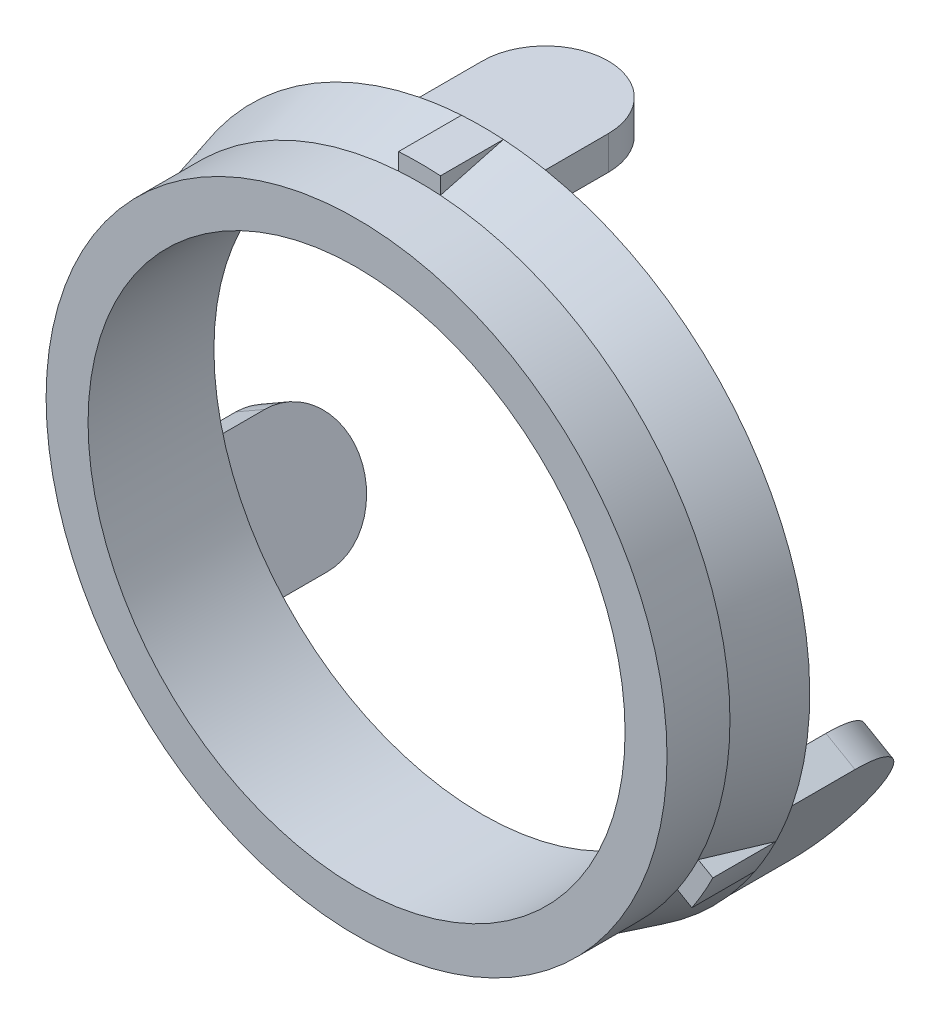
ISO-10303-21;
HEADER;
FILE_DESCRIPTION(('STEP AP214'),'2;1');
FILE_NAME('part.step','',(''),(''),'','','');
FILE_SCHEMA(('AUTOMOTIVE_DESIGN { 1 0 10303 214 1 1 1 1 }'));
ENDSEC;
DATA;
#1=APPLICATION_CONTEXT('core data for automotive mechanical design processes');
#2=APPLICATION_PROTOCOL_DEFINITION('international standard','automotive_design',2000,#1);
#3=PRODUCT_CONTEXT('',#1,'mechanical');
#4=PRODUCT('Part','Part','',(#3));
#5=PRODUCT_RELATED_PRODUCT_CATEGORY('part','',(#4));
#6=PRODUCT_DEFINITION_FORMATION('','',#4);
#7=PRODUCT_DEFINITION_CONTEXT('part definition',#1,'design');
#8=PRODUCT_DEFINITION('design','',#6,#7);
#9=PRODUCT_DEFINITION_SHAPE('','',#8);
#10=(LENGTH_UNIT() NAMED_UNIT(*) SI_UNIT(.MILLI.,.METRE.));
#11=(NAMED_UNIT(*) PLANE_ANGLE_UNIT() SI_UNIT($,.RADIAN.));
#12=(NAMED_UNIT(*) SI_UNIT($,.STERADIAN.) SOLID_ANGLE_UNIT());
#13=UNCERTAINTY_MEASURE_WITH_UNIT(LENGTH_MEASURE(1.E-05),#10,'distance_accuracy_value','');
#14=(GEOMETRIC_REPRESENTATION_CONTEXT(3) GLOBAL_UNCERTAINTY_ASSIGNED_CONTEXT((#13)) GLOBAL_UNIT_ASSIGNED_CONTEXT((#10,
#11,#12)) REPRESENTATION_CONTEXT('',''));
#15=CARTESIAN_POINT('',(0.,0.,0.));
#16=DIRECTION('',(0.,0.,1.));
#17=DIRECTION('',(1.,0.,0.));
#18=AXIS2_PLACEMENT_3D('',#15,#16,#17);
#19=CARTESIAN_POINT('',(39.0096189432334,0.,-7.50000000000003));
#20=DIRECTION('',(0.,0.,-1.));
#21=DIRECTION('',(-1.,0.,0.));
#22=AXIS2_PLACEMENT_3D('',#19,#20,#21);
#23=PLANE('',#22);
#24=CARTESIAN_POINT('',(0.,0.,-7.50000000000001));
#25=DIRECTION('',(0.,0.,1.));
#26=DIRECTION('',(1.,0.,0.));
#27=AXIS2_PLACEMENT_3D('',#24,#25,#26);
#28=CIRCLE('',#27,32.);
#29=CARTESIAN_POINT('',(32.,0.,-7.50000000000003));
#30=VERTEX_POINT('',#29);
#31=EDGE_CURVE('E452',#30,#30,#28,.T.);
#32=ORIENTED_EDGE('',*,*,#31,.T.);
#33=EDGE_LOOP('',(#32));
#34=FACE_BOUND('',#33,.T.);
#35=DIRECTION('',(0.499999999999992,-0.866025403784443,0.));
#36=VECTOR('',#35,1.);
#37=CARTESIAN_POINT('',(-33.4389567290363,-10.6457366310846,-7.5));
#38=LINE('',#37,#36);
#39=CARTESIAN_POINT('',(-33.4389567290363,-10.6457366310846,-7.5));
#40=VERTEX_POINT('',#39);
#41=CARTESIAN_POINT('',(-25.9389567290364,-23.6361176878513,-7.5));
#42=VERTEX_POINT('',#41);
#43=EDGE_CURVE('E200',#40,#42,#38,.T.);
#44=ORIENTED_EDGE('',*,*,#43,.F.);
#45=DIRECTION('',(0.866025403784443,0.499999999999992,0.));
#46=VECTOR('',#45,1.);
#47=CARTESIAN_POINT('',(-33.4389567290363,-10.6457366310846,-7.5));
#48=LINE('',#47,#46);
#49=CARTESIAN_POINT('',(-36.9030583441741,-12.6457366310846,-7.5));
#50=VERTEX_POINT('',#49);
#51=EDGE_CURVE('E209',#50,#40,#48,.T.);
#52=ORIENTED_EDGE('',*,*,#51,.F.);
#53=CARTESIAN_POINT('',(0.,0.,-7.50000000000001));
#54=DIRECTION('',(0.,0.,1.));
#55=DIRECTION('',(1.,0.,0.));
#56=AXIS2_PLACEMENT_3D('',#53,#54,#55);
#57=CIRCLE('',#56,39.0096189432334);
#58=CARTESIAN_POINT('',(-7.5,38.2818543189364,-7.50000000000001));
#59=VERTEX_POINT('',#58);
#60=EDGE_CURVE('E453',#59,#50,#57,.T.);
#61=ORIENTED_EDGE('',*,*,#60,.F.);
#62=DIRECTION('',(0.,1.,0.));
#63=VECTOR('',#62,1.);
#64=CARTESIAN_POINT('',(-7.5,34.2818543189364,-7.50000000000001));
#65=LINE('',#64,#63);
#66=CARTESIAN_POINT('',(-7.5,34.2818543189364,-7.50000000000001));
#67=VERTEX_POINT('',#66);
#68=EDGE_CURVE('E318',#67,#59,#65,.T.);
#69=ORIENTED_EDGE('',*,*,#68,.F.);
#70=DIRECTION('',(-1.,0.,0.));
#71=VECTOR('',#70,1.);
#72=CARTESIAN_POINT('',(7.5,34.2818543189364,-7.50000000000002));
#73=LINE('',#72,#71);
#74=CARTESIAN_POINT('',(7.5,34.2818543189364,-7.50000000000002));
#75=VERTEX_POINT('',#74);
#76=EDGE_CURVE('E314',#75,#67,#73,.T.);
#77=ORIENTED_EDGE('',*,*,#76,.F.);
#78=DIRECTION('',(0.,-1.,0.));
#79=VECTOR('',#78,1.);
#80=CARTESIAN_POINT('',(7.5,34.2818543189364,-7.50000000000002));
#81=LINE('',#80,#79);
#82=CARTESIAN_POINT('',(7.50000000000001,38.2818543189364,-7.50000000000002));
#83=VERTEX_POINT('',#82);
#84=EDGE_CURVE('E310',#83,#75,#81,.T.);
#85=ORIENTED_EDGE('',*,*,#84,.F.);
#86=CARTESIAN_POINT('',(36.9030583441739,-12.6457366310851,-7.50000000000003));
#87=VERTEX_POINT('',#86);
#88=EDGE_CURVE('E438',#87,#83,#57,.T.);
#89=ORIENTED_EDGE('',*,*,#88,.F.);
#90=DIRECTION('',(0.866025403784436,-0.500000000000004,0.));
#91=VECTOR('',#90,1.);
#92=CARTESIAN_POINT('',(33.4389567290362,-10.6457366310851,-7.50000000000003));
#93=LINE('',#92,#91);
#94=CARTESIAN_POINT('',(33.4389567290362,-10.6457366310851,-7.50000000000003));
#95=VERTEX_POINT('',#94);
#96=EDGE_CURVE('E245',#95,#87,#93,.T.);
#97=ORIENTED_EDGE('',*,*,#96,.F.);
#98=DIRECTION('',(0.500000000000004,0.866025403784436,0.));
#99=VECTOR('',#98,1.);
#100=CARTESIAN_POINT('',(25.9389567290361,-23.6361176878516,-7.50000000000002));
#101=LINE('',#100,#99);
#102=CARTESIAN_POINT('',(25.9389567290361,-23.6361176878516,-7.50000000000002));
#103=VERTEX_POINT('',#102);
#104=EDGE_CURVE('E241',#103,#95,#101,.T.);
#105=ORIENTED_EDGE('',*,*,#104,.F.);
#106=DIRECTION('',(-0.866025403784436,0.500000000000004,0.));
#107=VECTOR('',#106,1.);
#108=CARTESIAN_POINT('',(25.9389567290361,-23.6361176878516,-7.50000000000002));
#109=LINE('',#108,#107);
#110=CARTESIAN_POINT('',(29.4030583441739,-25.6361176878516,-7.50000000000003));
#111=VERTEX_POINT('',#110);
#112=EDGE_CURVE('E205',#111,#103,#109,.T.);
#113=ORIENTED_EDGE('',*,*,#112,.F.);
#114=CARTESIAN_POINT('',(-29.4030583441742,-25.6361176878512,-7.5));
#115=VERTEX_POINT('',#114);
#116=EDGE_CURVE('E434',#115,#111,#57,.T.);
#117=ORIENTED_EDGE('',*,*,#116,.F.);
#118=DIRECTION('',(-0.866025403784443,-0.499999999999992,0.));
#119=VECTOR('',#118,1.);
#120=CARTESIAN_POINT('',(-25.9389567290364,-23.6361176878513,-7.5));
#121=LINE('',#120,#119);
#122=EDGE_CURVE('E222',#42,#115,#121,.T.);
#123=ORIENTED_EDGE('',*,*,#122,.F.);
#124=EDGE_LOOP('',(#44,#52,#61,#69,#77,#85,#89,#97,#105,#113,#117,#123));
#125=FACE_BOUND('',#124,.T.);
#126=ADVANCED_FACE('F39',(#34,#125),#23,.T.);
#127=CARTESIAN_POINT('',(-34.9638736660772,-17.2996505270732,-7.5));
#128=VERTEX_POINT('',#127);
#129=EDGE_CURVE('E441',#50,#128,#57,.T.);
#130=ORIENTED_EDGE('',*,*,#129,.F.);
#131=DIRECTION('',(-0.499999999999992,0.866025403784443,0.));
#132=VECTOR('',#131,1.);
#133=CARTESIAN_POINT('',(-36.9030583441741,-12.6457366310846,-7.5));
#134=LINE('',#133,#132);
#135=EDGE_CURVE('E226',#115,#50,#134,.T.);
#136=ORIENTED_EDGE('',*,*,#135,.F.);
#137=CARTESIAN_POINT('',(-32.4638736660773,-21.6297775459954,-7.5));
#138=VERTEX_POINT('',#137);
#139=EDGE_CURVE('E437',#138,#115,#57,.T.);
#140=ORIENTED_EDGE('',*,*,#139,.F.);
#141=CARTESIAN_POINT('',(0.,0.,-7.50000000000001));
#142=DIRECTION('',(0.,0.,-1.));
#143=DIRECTION('',(-0.499999999999992,0.866025403784443,0.));
#144=AXIS2_PLACEMENT_3D('',#141,#142,#143);
#145=CIRCLE('',#144,39.0096189432334);
#146=EDGE_CURVE('E265',#138,#128,#145,.T.);
#147=ORIENTED_EDGE('',*,*,#146,.T.);
#148=EDGE_LOOP('',(#130,#136,#140,#147));
#149=FACE_BOUND('',#148,.T.);
#150=ADVANCED_FACE('F414',(#149),#23,.T.);
#151=CARTESIAN_POINT('',(32.463873666077,-21.6297775459959,-7.50000000000003));
#152=VERTEX_POINT('',#151);
#153=EDGE_CURVE('E426',#111,#152,#57,.T.);
#154=ORIENTED_EDGE('',*,*,#153,.F.);
#155=DIRECTION('',(-0.500000000000004,-0.866025403784436,0.));
#156=VECTOR('',#155,1.);
#157=CARTESIAN_POINT('',(29.4030583441739,-25.6361176878516,-7.50000000000003));
#158=LINE('',#157,#156);
#159=EDGE_CURVE('E249',#87,#111,#158,.T.);
#160=ORIENTED_EDGE('',*,*,#159,.F.);
#161=CARTESIAN_POINT('',(34.963873666077,-17.2996505270737,-7.50000000000003));
#162=VERTEX_POINT('',#161);
#163=EDGE_CURVE('E435',#162,#87,#57,.T.);
#164=ORIENTED_EDGE('',*,*,#163,.F.);
#165=CARTESIAN_POINT('',(0.,0.,-7.50000000000001));
#166=DIRECTION('',(0.,0.,-1.));
#167=DIRECTION('',(-0.500000000000004,-0.866025403784436,0.));
#168=AXIS2_PLACEMENT_3D('',#165,#166,#167);
#169=CIRCLE('',#168,39.0096189432334);
#170=EDGE_CURVE('E284',#162,#152,#169,.T.);
#171=ORIENTED_EDGE('',*,*,#170,.T.);
#172=EDGE_LOOP('',(#154,#160,#164,#171));
#173=FACE_BOUND('',#172,.T.);
#174=ADVANCED_FACE('F405',(#173),#23,.T.);
#175=CARTESIAN_POINT('',(0.,0.,0.));
#176=DIRECTION('',(0.,0.,-1.));
#177=DIRECTION('',(-1.,0.,0.));
#178=AXIS2_PLACEMENT_3D('',#175,#176,#177);
#179=CONICAL_SURFACE('',#178,37.,0.261799387799142);
#180=CARTESIAN_POINT('',(-32.4639201718391,-21.6298043961095,-7.5002));
#181=CARTESIAN_POINT('',(-32.1732422755763,-21.4619814344548,-6.25012366516664));
#182=CARTESIAN_POINT('',(-31.8825487891638,-21.2941494718228,-5.00005216442005));
#183=CARTESIAN_POINT('',(-31.3011306360358,-20.9584675446026,-2.49991883108672));
#184=CARTESIAN_POINT('',(-31.0104059693204,-20.7906175800144,-1.24985699849997));
#185=CARTESIAN_POINT('',(-30.7196657124552,-20.622758614449,0.000199999999999813));
#186=B_SPLINE_CURVE_WITH_KNOTS('',3,(#180,#181,#182,#183,#184,#185),.UNSPECIFIED.,.F.,.F.,(4,2,
4),(0.,3.88305823408842,7.76611646821942),.UNSPECIFIED.);
#187=CARTESIAN_POINT('',(-30.7197122289209,-20.622785470743,0.));
#188=VERTEX_POINT('',#187);
#189=EDGE_CURVE('E581',#138,#188,#186,.T.);
#190=ORIENTED_EDGE('',*,*,#189,.F.);
#191=ORIENTED_EDGE('',*,*,#139,.T.);
#192=ORIENTED_EDGE('',*,*,#116,.T.);
#193=ORIENTED_EDGE('',*,*,#153,.T.);
#194=CARTESIAN_POINT('',(30.7196657124549,-20.6227586144495,0.000199999999973979));
#195=CARTESIAN_POINT('',(31.0104059693201,-20.7906175800149,-1.2498569985));
#196=CARTESIAN_POINT('',(31.3011306360355,-20.9584675446031,-2.49991883108674));
#197=CARTESIAN_POINT('',(31.8825487891635,-21.2941494718232,-5.00005216442007));
#198=CARTESIAN_POINT('',(32.173242275576,-21.4619814344552,-6.25012366516666));
#199=CARTESIAN_POINT('',(32.4639201718388,-21.62980439611,-7.50020000000002));
#200=B_SPLINE_CURVE_WITH_KNOTS('',3,(#194,#195,#196,#197,#198,#199),.UNSPECIFIED.,.F.,.F.,(4,2,
4),(0.,3.88305823413099,7.7661164682194),.UNSPECIFIED.);
#201=CARTESIAN_POINT('',(30.7197122289206,-20.6227854707435,0.));
#202=VERTEX_POINT('',#201);
#203=EDGE_CURVE('E491',#202,#152,#200,.T.);
#204=ORIENTED_EDGE('',*,*,#203,.F.);
#205=CARTESIAN_POINT('',(0.,0.,0.));
#206=DIRECTION('',(0.,0.,1.));
#207=DIRECTION('',(1.,0.,0.));
#208=AXIS2_PLACEMENT_3D('',#205,#206,#207);
#209=CIRCLE('',#208,37.);
#210=EDGE_CURVE('E564',#188,#202,#209,.T.);
#211=ORIENTED_EDGE('',*,*,#210,.F.);
#212=EDGE_LOOP('',(#190,#191,#192,#193,#204,#211));
#213=FACE_BOUND('',#212,.T.);
#214=ADVANCED_FACE('F411',(#213),#179,.T.);
#215=CARTESIAN_POINT('',(34.9639201718388,-17.2996773771878,-7.50020000000001));
#216=CARTESIAN_POINT('',(34.6732422755761,-17.131854415533,-6.25012366516666));
#217=CARTESIAN_POINT('',(34.3825487891635,-16.964022452901,-5.00005216442007));
#218=CARTESIAN_POINT('',(33.8011306360355,-16.6283405256809,-2.49991883108674));
#219=CARTESIAN_POINT('',(33.5104059693201,-16.4604905610927,-1.2498569985));
#220=CARTESIAN_POINT('',(33.2196657124549,-16.2926315955273,0.000199999999971305));
#221=B_SPLINE_CURVE_WITH_KNOTS('',3,(#215,#216,#217,#218,#219,#220),.UNSPECIFIED.,.F.,.F.,(4,2,
4),(0.,3.88305823408841,7.7661164682194),.UNSPECIFIED.);
#222=CARTESIAN_POINT('',(33.2197122289206,-16.2926584518213,0.));
#223=VERTEX_POINT('',#222);
#224=EDGE_CURVE('E502',#162,#223,#221,.T.);
#225=ORIENTED_EDGE('',*,*,#224,.F.);
#226=ORIENTED_EDGE('',*,*,#163,.T.);
#227=ORIENTED_EDGE('',*,*,#88,.T.);
#228=CARTESIAN_POINT('',(2.5,38.9294280730693,-7.50000000000001));
#229=VERTEX_POINT('',#228);
#230=EDGE_CURVE('E444',#83,#229,#57,.T.);
#231=ORIENTED_EDGE('',*,*,#230,.T.);
#232=CARTESIAN_POINT('',(2.5,34.4942087681963,9.01407818865996));
#233=CARTESIAN_POINT('',(2.5,35.0657074153788,6.88679370650943));
#234=CARTESIAN_POINT('',(2.5,35.6371379779062,4.75949093438337));
#235=CARTESIAN_POINT('',(2.5,36.7798791342439,0.504853173492177));
#236=CARTESIAN_POINT('',(2.5,37.3511897280547,-1.62248181527288));
#237=CARTESIAN_POINT('',(2.5,38.493707150006,-5.87717965526099));
#238=CARTESIAN_POINT('',(2.5,39.0649139781465,-8.00454250648401));
#239=CARTESIAN_POINT('',(2.49999999999999,40.2072362020273,-12.259292762519));
#240=CARTESIAN_POINT('',(2.49999999999999,40.7783515977672,-14.386680167331));
#241=CARTESIAN_POINT('',(2.49999999999999,41.3494274423728,-16.51407818866));
#242=B_SPLINE_CURVE_WITH_KNOTS('',3,(#232,#233,#234,#235,#236,#237,#238,#239,#240,#241),
.UNSPECIFIED.,.F.,.F.,(4,2,2,2,4),(0.,6.60814268238509,13.216285348593,19.8244280108105,
26.4325706891827),.UNSPECIFIED.);
#243=CARTESIAN_POINT('',(2.5,36.9154439225644,0.));
#244=VERTEX_POINT('',#243);
#245=EDGE_CURVE('E354',#244,#229,#242,.T.);
#246=ORIENTED_EDGE('',*,*,#245,.F.);
#247=EDGE_CURVE('E551',#223,#244,#209,.T.);
#248=ORIENTED_EDGE('',*,*,#247,.F.);
#249=EDGE_LOOP('',(#225,#226,#227,#231,#246,#248));
#250=FACE_BOUND('',#249,.T.);
#251=ADVANCED_FACE('F409',(#250),#179,.T.);
#252=CARTESIAN_POINT('',(-33.2196657124551,-16.2926315955268,0.000199999999999204));
#253=CARTESIAN_POINT('',(-33.5104059693203,-16.4604905610922,-1.24985699849997));
#254=CARTESIAN_POINT('',(-33.8011306360357,-16.6283405256804,-2.49991883108672));
#255=CARTESIAN_POINT('',(-34.3825487891637,-16.9640224529006,-5.00005216442005));
#256=CARTESIAN_POINT('',(-34.6732422755763,-17.1318544155325,-6.25012366516664));
#257=CARTESIAN_POINT('',(-34.9639201718391,-17.2996773771873,-7.5002));
#258=B_SPLINE_CURVE_WITH_KNOTS('',3,(#252,#253,#254,#255,#256,#257),.UNSPECIFIED.,.F.,.F.,(4,2,
4),(0.,3.883058234131,7.76611646821941),.UNSPECIFIED.);
#259=CARTESIAN_POINT('',(-33.2197122289208,-16.2926584518208,0.));
#260=VERTEX_POINT('',#259);
#261=EDGE_CURVE('E554',#260,#128,#258,.T.);
#262=ORIENTED_EDGE('',*,*,#261,.F.);
#263=CARTESIAN_POINT('',(-2.5,36.9154439225644,0.));
#264=VERTEX_POINT('',#263);
#265=EDGE_CURVE('E553',#264,#260,#209,.T.);
#266=ORIENTED_EDGE('',*,*,#265,.F.);
#267=CARTESIAN_POINT('',(-2.5,41.3494274423728,-16.51407818866));
#268=CARTESIAN_POINT('',(-2.5,40.7783515977672,-14.386680167331));
#269=CARTESIAN_POINT('',(-2.5,40.2072362020273,-12.259292762519));
#270=CARTESIAN_POINT('',(-2.5,39.0649139781465,-8.00454250648401));
#271=CARTESIAN_POINT('',(-2.5,38.493707150006,-5.87717965526098));
#272=CARTESIAN_POINT('',(-2.5,37.3511897280547,-1.62248181527288));
#273=CARTESIAN_POINT('',(-2.5,36.7798791342439,0.504853173492177));
#274=CARTESIAN_POINT('',(-2.5,35.6371379779062,4.75949093438337));
#275=CARTESIAN_POINT('',(-2.5,35.0657074153788,6.88679370650943));
#276=CARTESIAN_POINT('',(-2.5,34.4942087681963,9.01407818865996));
#277=B_SPLINE_CURVE_WITH_KNOTS('',3,(#267,#268,#269,#270,#271,#272,#273,#274,#275,#276),
.UNSPECIFIED.,.F.,.F.,(4,2,2,2,4),(0.,6.60814267837222,13.2162853405897,19.8244280067976,
26.4325706891827),.UNSPECIFIED.);
#278=CARTESIAN_POINT('',(-2.5,38.9294280730693,-7.50000000000001));
#279=VERTEX_POINT('',#278);
#280=EDGE_CURVE('E367',#279,#264,#277,.T.);
#281=ORIENTED_EDGE('',*,*,#280,.F.);
#282=EDGE_CURVE('E459',#279,#59,#57,.T.);
#283=ORIENTED_EDGE('',*,*,#282,.T.);
#284=ORIENTED_EDGE('',*,*,#60,.T.);
#285=ORIENTED_EDGE('',*,*,#129,.T.);
#286=EDGE_LOOP('',(#262,#266,#281,#283,#284,#285));
#287=FACE_BOUND('',#286,.T.);
#288=ADVANCED_FACE('F374',(#287),#179,.T.);
#289=DIRECTION('',(1.,0.,0.));
#290=VECTOR('',#289,1.);
#291=CARTESIAN_POINT('',(7.5,38.2818543189364,-7.50000000000002));
#292=LINE('',#291,#290);
#293=EDGE_CURVE('E322',#59,#83,#292,.T.);
#294=ORIENTED_EDGE('',*,*,#293,.F.);
#295=ORIENTED_EDGE('',*,*,#282,.F.);
#296=EDGE_CURVE('E442',#229,#279,#57,.T.);
#297=ORIENTED_EDGE('',*,*,#296,.F.);
#298=ORIENTED_EDGE('',*,*,#230,.F.);
#299=EDGE_LOOP('',(#294,#295,#297,#298));
#300=FACE_BOUND('',#299,.T.);
#301=ADVANCED_FACE('F401',(#300),#23,.T.);
#302=CARTESIAN_POINT('',(0.,0.,7.5));
#303=DIRECTION('',(0.,0.,1.));
#304=DIRECTION('',(1.,0.,0.));
#305=AXIS2_PLACEMENT_3D('',#302,#303,#304);
#306=CYLINDRICAL_SURFACE('',#305,32.);
#307=CARTESIAN_POINT('',(0.,0.,7.50000000000001));
#308=DIRECTION('',(0.,0.,1.));
#309=DIRECTION('',(1.,0.,0.));
#310=AXIS2_PLACEMENT_3D('',#307,#308,#309);
#311=CIRCLE('',#310,32.);
#312=CARTESIAN_POINT('',(32.,0.,7.5));
#313=VERTEX_POINT('',#312);
#314=EDGE_CURVE('E567',#313,#313,#311,.T.);
#315=ORIENTED_EDGE('',*,*,#314,.T.);
#316=EDGE_LOOP('',(#315));
#317=FACE_BOUND('',#316,.T.);
#318=ORIENTED_EDGE('',*,*,#31,.F.);
#319=EDGE_LOOP('',(#318));
#320=FACE_BOUND('',#319,.T.);
#321=ADVANCED_FACE('F398',(#317,#320),#306,.F.);
#322=CARTESIAN_POINT('',(32.,0.,7.5));
#323=DIRECTION('',(0.,0.,1.));
#324=DIRECTION('',(1.,0.,0.));
#325=AXIS2_PLACEMENT_3D('',#322,#323,#324);
#326=PLANE('',#325);
#327=CARTESIAN_POINT('',(0.,0.,7.50000000000002));
#328=DIRECTION('',(0.,0.,1.));
#329=DIRECTION('',(1.,0.,0.));
#330=AXIS2_PLACEMENT_3D('',#327,#328,#329);
#331=CIRCLE('',#330,37.);
#332=CARTESIAN_POINT('',(37.,0.,7.5));
#333=VERTEX_POINT('',#332);
#334=EDGE_CURVE('E563',#333,#333,#331,.T.);
#335=ORIENTED_EDGE('',*,*,#334,.T.);
#336=EDGE_LOOP('',(#335));
#337=FACE_BOUND('',#336,.T.);
#338=ORIENTED_EDGE('',*,*,#314,.F.);
#339=EDGE_LOOP('',(#338));
#340=FACE_BOUND('',#339,.T.);
#341=ADVANCED_FACE('F394',(#337,#340),#326,.T.);
#342=CARTESIAN_POINT('',(0.,0.,7.5));
#343=DIRECTION('',(0.,0.,1.));
#344=DIRECTION('',(1.,0.,0.));
#345=AXIS2_PLACEMENT_3D('',#342,#343,#344);
#346=CYLINDRICAL_SURFACE('',#345,37.);
#347=EDGE_CURVE('E547',#244,#264,#209,.T.);
#348=ORIENTED_EDGE('',*,*,#347,.T.);
#349=ORIENTED_EDGE('',*,*,#265,.T.);
#350=EDGE_CURVE('E557',#260,#188,#209,.T.);
#351=ORIENTED_EDGE('',*,*,#350,.T.);
#352=ORIENTED_EDGE('',*,*,#210,.T.);
#353=EDGE_CURVE('E558',#202,#223,#209,.T.);
#354=ORIENTED_EDGE('',*,*,#353,.T.);
#355=ORIENTED_EDGE('',*,*,#247,.T.);
#356=EDGE_LOOP('',(#348,#349,#351,#352,#354,#355));
#357=FACE_BOUND('',#356,.T.);
#358=ORIENTED_EDGE('',*,*,#334,.F.);
#359=EDGE_LOOP('',(#358));
#360=FACE_BOUND('',#359,.T.);
#361=ADVANCED_FACE('F390',(#357,#360),#346,.T.);
#362=CARTESIAN_POINT('',(0.,0.,0.));
#363=DIRECTION('',(0.,0.,-1.));
#364=DIRECTION('',(-1.,0.,0.));
#365=AXIS2_PLACEMENT_3D('',#362,#363,#364);
#366=CYLINDRICAL_SURFACE('',#365,39.0096189432334);
#367=ORIENTED_EDGE('',*,*,#296,.T.);
#368=DIRECTION('',(0.,0.,-1.));
#369=VECTOR('',#368,1.);
#370=CARTESIAN_POINT('',(-2.5,38.9294280730693,0.));
#371=LINE('',#370,#369);
#372=CARTESIAN_POINT('',(-2.5,38.9294280730693,0.));
#373=VERTEX_POINT('',#372);
#374=EDGE_CURVE('E351',#373,#279,#371,.T.);
#375=ORIENTED_EDGE('',*,*,#374,.F.);
#376=CARTESIAN_POINT('',(0.,0.,0.));
#377=DIRECTION('',(0.,0.,-1.));
#378=DIRECTION('',(1.,0.,0.));
#379=AXIS2_PLACEMENT_3D('',#376,#377,#378);
#380=CIRCLE('',#379,39.0096189432334);
#381=CARTESIAN_POINT('',(2.5,38.9294280730693,0.));
#382=VERTEX_POINT('',#381);
#383=EDGE_CURVE('E339',#373,#382,#380,.T.);
#384=ORIENTED_EDGE('',*,*,#383,.T.);
#385=DIRECTION('',(0.,0.,-1.));
#386=VECTOR('',#385,1.);
#387=CARTESIAN_POINT('',(2.5,38.9294280730693,0.));
#388=LINE('',#387,#386);
#389=EDGE_CURVE('E350',#382,#229,#388,.T.);
#390=ORIENTED_EDGE('',*,*,#389,.T.);
#391=EDGE_LOOP('',(#367,#375,#384,#390));
#392=FACE_BOUND('',#391,.T.);
#393=ADVANCED_FACE('F387',(#392),#366,.T.);
#394=CARTESIAN_POINT('',(-2.5,33.9294280730693,0.));
#395=DIRECTION('',(-1.,0.,0.));
#396=DIRECTION('',(0.,-1.,0.));
#397=AXIS2_PLACEMENT_3D('',#394,#395,#396);
#398=PLANE('',#397);
#399=ORIENTED_EDGE('',*,*,#374,.T.);
#400=ORIENTED_EDGE('',*,*,#280,.T.);
#401=DIRECTION('',(0.,1.,0.));
#402=VECTOR('',#401,1.);
#403=CARTESIAN_POINT('',(-2.5,33.9294280730693,0.));
#404=LINE('',#403,#402);
#405=EDGE_CURVE('E347',#264,#373,#404,.T.);
#406=ORIENTED_EDGE('',*,*,#405,.T.);
#407=EDGE_LOOP('',(#399,#400,#406));
#408=FACE_BOUND('',#407,.T.);
#409=ADVANCED_FACE('F383',(#408),#398,.T.);
#410=CARTESIAN_POINT('',(2.5,38.9294280730693,0.));
#411=DIRECTION('',(1.,0.,0.));
#412=DIRECTION('',(0.,0.,-1.));
#413=AXIS2_PLACEMENT_3D('',#410,#411,#412);
#414=PLANE('',#413);
#415=DIRECTION('',(0.,-1.,0.));
#416=VECTOR('',#415,1.);
#417=CARTESIAN_POINT('',(2.5,38.9294280730693,0.));
#418=LINE('',#417,#416);
#419=EDGE_CURVE('E343',#382,#244,#418,.T.);
#420=ORIENTED_EDGE('',*,*,#419,.T.);
#421=ORIENTED_EDGE('',*,*,#245,.T.);
#422=ORIENTED_EDGE('',*,*,#389,.F.);
#423=EDGE_LOOP('',(#420,#421,#422));
#424=FACE_BOUND('',#423,.T.);
#425=ADVANCED_FACE('F378',(#424),#414,.T.);
#426=CARTESIAN_POINT('',(0.,0.,0.));
#427=DIRECTION('',(0.,0.,1.));
#428=DIRECTION('',(1.,0.,0.));
#429=AXIS2_PLACEMENT_3D('',#426,#427,#428);
#430=PLANE('',#429);
#431=ORIENTED_EDGE('',*,*,#405,.F.);
#432=ORIENTED_EDGE('',*,*,#347,.F.);
#433=ORIENTED_EDGE('',*,*,#419,.F.);
#434=ORIENTED_EDGE('',*,*,#383,.F.);
#435=EDGE_LOOP('',(#431,#432,#433,#434));
#436=FACE_BOUND('',#435,.T.);
#437=ADVANCED_FACE('F382',(#436),#430,.T.);
#438=CARTESIAN_POINT('',(7.49999999999999,34.2818543189364,-22.5));
#439=DIRECTION('',(-1.,0.,0.));
#440=DIRECTION('',(0.,0.,1.));
#441=AXIS2_PLACEMENT_3D('',#438,#439,#440);
#442=PLANE('',#441);
#443=DIRECTION('',(0.,0.,1.));
#444=VECTOR('',#443,1.);
#445=CARTESIAN_POINT('',(7.49999999999999,34.2818543189364,-22.5));
#446=LINE('',#445,#444);
#447=CARTESIAN_POINT('',(7.49999999999999,34.2818543189364,-15.));
#448=VERTEX_POINT('',#447);
#449=EDGE_CURVE('E336',#448,#75,#446,.T.);
#450=ORIENTED_EDGE('',*,*,#449,.F.);
#451=DIRECTION('',(0.,-1.,0.));
#452=VECTOR('',#451,1.);
#453=CARTESIAN_POINT('',(7.49999999999999,34.2818543189364,-15.));
#454=LINE('',#453,#452);
#455=CARTESIAN_POINT('',(7.49999999999999,38.2818543189364,-15.));
#456=VERTEX_POINT('',#455);
#457=EDGE_CURVE('E488',#448,#456,#454,.F.);
#458=ORIENTED_EDGE('',*,*,#457,.T.);
#459=DIRECTION('',(0.,0.,1.));
#460=VECTOR('',#459,1.);
#461=CARTESIAN_POINT('',(7.49999999999999,38.2818543189364,-22.5));
#462=LINE('',#461,#460);
#463=EDGE_CURVE('E326',#456,#83,#462,.T.);
#464=ORIENTED_EDGE('',*,*,#463,.T.);
#465=ORIENTED_EDGE('',*,*,#84,.T.);
#466=EDGE_LOOP('',(#450,#458,#464,#465));
#467=FACE_BOUND('',#466,.T.);
#468=ADVANCED_FACE('F534',(#467),#442,.F.);
#469=CARTESIAN_POINT('',(7.49999999999999,34.2818543189364,-22.5));
#470=DIRECTION('',(0.,1.,0.));
#471=DIRECTION('',(0.,0.,1.));
#472=AXIS2_PLACEMENT_3D('',#469,#470,#471);
#473=PLANE('',#472);
#474=DIRECTION('',(0.,0.,1.));
#475=VECTOR('',#474,1.);
#476=CARTESIAN_POINT('',(-7.50000000000001,34.2818543189364,-22.5));
#477=LINE('',#476,#475);
#478=CARTESIAN_POINT('',(-7.50000000000001,34.2818543189364,-15.));
#479=VERTEX_POINT('',#478);
#480=EDGE_CURVE('E333',#479,#67,#477,.T.);
#481=ORIENTED_EDGE('',*,*,#480,.F.);
#482=CARTESIAN_POINT('',(0.,34.2818543189364,-15.));
#483=DIRECTION('',(0.,1.,0.));
#484=DIRECTION('',(0.,0.,1.));
#485=AXIS2_PLACEMENT_3D('',#482,#483,#484);
#486=CIRCLE('',#485,7.5);
#487=CARTESIAN_POINT('',(0.,34.2818543189364,-22.5));
#488=VERTEX_POINT('',#487);
#489=EDGE_CURVE('E485',#479,#488,#486,.F.);
#490=ORIENTED_EDGE('',*,*,#489,.T.);
#491=CARTESIAN_POINT('',(0.,34.2818543189364,-15.));
#492=DIRECTION('',(0.,1.,0.));
#493=DIRECTION('',(0.,0.,1.));
#494=AXIS2_PLACEMENT_3D('',#491,#492,#493);
#495=CIRCLE('',#494,7.5);
#496=EDGE_CURVE('E482',#488,#448,#495,.F.);
#497=ORIENTED_EDGE('',*,*,#496,.T.);
#498=ORIENTED_EDGE('',*,*,#449,.T.);
#499=ORIENTED_EDGE('',*,*,#76,.T.);
#500=EDGE_LOOP('',(#481,#490,#497,#498,#499));
#501=FACE_BOUND('',#500,.T.);
#502=ADVANCED_FACE('F530',(#501),#473,.F.);
#503=CARTESIAN_POINT('',(-7.50000000000001,34.2818543189364,-22.5));
#504=DIRECTION('',(1.,0.,0.));
#505=DIRECTION('',(0.,0.,-1.));
#506=AXIS2_PLACEMENT_3D('',#503,#504,#505);
#507=PLANE('',#506);
#508=DIRECTION('',(0.,0.,1.));
#509=VECTOR('',#508,1.);
#510=CARTESIAN_POINT('',(-7.50000000000001,38.2818543189364,-22.5));
#511=LINE('',#510,#509);
#512=CARTESIAN_POINT('',(-7.50000000000001,38.2818543189364,-15.));
#513=VERTEX_POINT('',#512);
#514=EDGE_CURVE('E330',#513,#59,#511,.T.);
#515=ORIENTED_EDGE('',*,*,#514,.F.);
#516=DIRECTION('',(0.,1.,0.));
#517=VECTOR('',#516,1.);
#518=CARTESIAN_POINT('',(-7.50000000000001,34.2818543189364,-15.));
#519=LINE('',#518,#517);
#520=EDGE_CURVE('E476',#513,#479,#519,.F.);
#521=ORIENTED_EDGE('',*,*,#520,.T.);
#522=ORIENTED_EDGE('',*,*,#480,.T.);
#523=ORIENTED_EDGE('',*,*,#68,.T.);
#524=EDGE_LOOP('',(#515,#521,#522,#523));
#525=FACE_BOUND('',#524,.T.);
#526=ADVANCED_FACE('F527',(#525),#507,.F.);
#527=CARTESIAN_POINT('',(7.49999999999999,38.2818543189364,-22.5));
#528=DIRECTION('',(0.,-1.,0.));
#529=DIRECTION('',(0.,0.,-1.));
#530=AXIS2_PLACEMENT_3D('',#527,#528,#529);
#531=PLANE('',#530);
#532=CARTESIAN_POINT('',(0.,38.2818543189364,-15.));
#533=DIRECTION('',(0.,-1.,0.));
#534=DIRECTION('',(0.,0.,-1.));
#535=AXIS2_PLACEMENT_3D('',#532,#533,#534);
#536=CIRCLE('',#535,7.5);
#537=CARTESIAN_POINT('',(0.,38.2818543189364,-22.5));
#538=VERTEX_POINT('',#537);
#539=EDGE_CURVE('E466',#456,#538,#536,.F.);
#540=ORIENTED_EDGE('',*,*,#539,.T.);
#541=CARTESIAN_POINT('',(0.,38.2818543189364,-15.));
#542=DIRECTION('',(0.,-1.,0.));
#543=DIRECTION('',(0.,0.,-1.));
#544=AXIS2_PLACEMENT_3D('',#541,#542,#543);
#545=CIRCLE('',#544,7.5);
#546=EDGE_CURVE('E470',#538,#513,#545,.F.);
#547=ORIENTED_EDGE('',*,*,#546,.T.);
#548=ORIENTED_EDGE('',*,*,#514,.T.);
#549=ORIENTED_EDGE('',*,*,#293,.T.);
#550=ORIENTED_EDGE('',*,*,#463,.F.);
#551=EDGE_LOOP('',(#540,#547,#548,#549,#550));
#552=FACE_BOUND('',#551,.T.);
#553=ADVANCED_FACE('F523',(#552),#531,.F.);
#554=CARTESIAN_POINT('',(0.,0.,-15.));
#555=DIRECTION('',(0.,-1.,0.));
#556=DIRECTION('',(0.,0.,-1.));
#557=AXIS2_PLACEMENT_3D('',#554,#555,#556);
#558=CYLINDRICAL_SURFACE('',#557,7.5);
#559=ORIENTED_EDGE('',*,*,#457,.F.);
#560=ORIENTED_EDGE('',*,*,#496,.F.);
#561=DIRECTION('',(0.,-1.,0.));
#562=VECTOR('',#561,1.);
#563=CARTESIAN_POINT('',(0.,0.,-22.5));
#564=LINE('',#563,#562);
#565=EDGE_CURVE('E306',#538,#488,#564,.T.);
#566=ORIENTED_EDGE('',*,*,#565,.F.);
#567=ORIENTED_EDGE('',*,*,#539,.F.);
#568=EDGE_LOOP('',(#559,#560,#566,#567));
#569=FACE_BOUND('',#568,.T.);
#570=ADVANCED_FACE('F526',(#569),#558,.T.);
#571=CARTESIAN_POINT('',(0.,0.,-15.));
#572=DIRECTION('',(0.,1.,0.));
#573=DIRECTION('',(0.,0.,1.));
#574=AXIS2_PLACEMENT_3D('',#571,#572,#573);
#575=CYLINDRICAL_SURFACE('',#574,7.5);
#576=ORIENTED_EDGE('',*,*,#489,.F.);
#577=ORIENTED_EDGE('',*,*,#520,.F.);
#578=ORIENTED_EDGE('',*,*,#546,.F.);
#579=ORIENTED_EDGE('',*,*,#565,.T.);
#580=EDGE_LOOP('',(#576,#577,#578,#579));
#581=FACE_BOUND('',#580,.T.);
#582=ADVANCED_FACE('F521',(#581),#575,.T.);
#583=CARTESIAN_POINT('',(0.,0.,0.));
#584=DIRECTION('',(0.,0.,-1.));
#585=DIRECTION('',(-1.,0.,0.));
#586=AXIS2_PLACEMENT_3D('',#583,#584,#585);
#587=CYLINDRICAL_SURFACE('',#586,39.0096189432334);
#588=ORIENTED_EDGE('',*,*,#170,.F.);
#589=DIRECTION('',(0.,0.,-1.));
#590=VECTOR('',#589,1.);
#591=CARTESIAN_POINT('',(34.963873666077,-17.2996505270737,0.));
#592=LINE('',#591,#590);
#593=CARTESIAN_POINT('',(34.963873666077,-17.2996505270737,0.));
#594=VERTEX_POINT('',#593);
#595=EDGE_CURVE('E303',#594,#162,#592,.T.);
#596=ORIENTED_EDGE('',*,*,#595,.F.);
#597=CARTESIAN_POINT('',(0.,0.,0.));
#598=DIRECTION('',(0.,0.,-1.));
#599=DIRECTION('',(-0.500000000000004,-0.866025403784436,0.));
#600=AXIS2_PLACEMENT_3D('',#597,#598,#599);
#601=CIRCLE('',#600,39.0096189432334);
#602=CARTESIAN_POINT('',(32.463873666077,-21.6297775459959,0.));
#603=VERTEX_POINT('',#602);
#604=EDGE_CURVE('E288',#594,#603,#601,.T.);
#605=ORIENTED_EDGE('',*,*,#604,.T.);
#606=DIRECTION('',(0.,0.,-1.));
#607=VECTOR('',#606,1.);
#608=CARTESIAN_POINT('',(32.463873666077,-21.6297775459959,0.));
#609=LINE('',#608,#607);
#610=EDGE_CURVE('E299',#603,#152,#609,.T.);
#611=ORIENTED_EDGE('',*,*,#610,.T.);
#612=EDGE_LOOP('',(#588,#596,#605,#611));
#613=FACE_BOUND('',#612,.T.);
#614=ADVANCED_FACE('F518',(#613),#587,.T.);
#615=CARTESIAN_POINT('',(30.6337466471548,-14.7996505270737,0.));
#616=DIRECTION('',(0.500000000000004,0.866025403784436,0.));
#617=DIRECTION('',(-0.866025403784436,0.500000000000004,0.));
#618=AXIS2_PLACEMENT_3D('',#615,#616,#617);
#619=PLANE('',#618);
#620=ORIENTED_EDGE('',*,*,#595,.T.);
#621=ORIENTED_EDGE('',*,*,#224,.T.);
#622=DIRECTION('',(0.866025403784436,-0.500000000000005,0.));
#623=VECTOR('',#622,1.);
#624=CARTESIAN_POINT('',(30.6337466471548,-14.7996505270737,0.));
#625=LINE('',#624,#623);
#626=EDGE_CURVE('E296',#223,#594,#625,.T.);
#627=ORIENTED_EDGE('',*,*,#626,.T.);
#628=EDGE_LOOP('',(#620,#621,#627));
#629=FACE_BOUND('',#628,.T.);
#630=ADVANCED_FACE('F514',(#629),#619,.T.);
#631=CARTESIAN_POINT('',(32.463873666077,-21.6297775459959,0.));
#632=DIRECTION('',(-0.500000000000004,-0.866025403784436,0.));
#633=DIRECTION('',(0.866025403784436,-0.500000000000004,0.));
#634=AXIS2_PLACEMENT_3D('',#631,#632,#633);
#635=PLANE('',#634);
#636=DIRECTION('',(-0.866025403784436,0.500000000000004,0.));
#637=VECTOR('',#636,1.);
#638=CARTESIAN_POINT('',(32.463873666077,-21.6297775459959,0.));
#639=LINE('',#638,#637);
#640=EDGE_CURVE('E292',#603,#202,#639,.T.);
#641=ORIENTED_EDGE('',*,*,#640,.T.);
#642=ORIENTED_EDGE('',*,*,#203,.T.);
#643=ORIENTED_EDGE('',*,*,#610,.F.);
#644=EDGE_LOOP('',(#641,#642,#643));
#645=FACE_BOUND('',#644,.T.);
#646=ADVANCED_FACE('F509',(#645),#635,.T.);
#647=CARTESIAN_POINT('',(0.,0.,0.));
#648=DIRECTION('',(0.,0.,1.));
#649=DIRECTION('',(-0.500000000000004,-0.866025403784436,0.));
#650=AXIS2_PLACEMENT_3D('',#647,#648,#649);
#651=PLANE('',#650);
#652=ORIENTED_EDGE('',*,*,#626,.F.);
#653=ORIENTED_EDGE('',*,*,#353,.F.);
#654=ORIENTED_EDGE('',*,*,#640,.F.);
#655=ORIENTED_EDGE('',*,*,#604,.F.);
#656=EDGE_LOOP('',(#652,#653,#654,#655));
#657=FACE_BOUND('',#656,.T.);
#658=ADVANCED_FACE('F513',(#657),#651,.T.);
#659=CARTESIAN_POINT('',(0.,0.,0.));
#660=DIRECTION('',(0.,0.,-1.));
#661=DIRECTION('',(-1.,0.,0.));
#662=AXIS2_PLACEMENT_3D('',#659,#660,#661);
#663=CYLINDRICAL_SURFACE('',#662,39.0096189432334);
#664=ORIENTED_EDGE('',*,*,#146,.F.);
#665=DIRECTION('',(0.,0.,-1.));
#666=VECTOR('',#665,1.);
#667=CARTESIAN_POINT('',(-32.4638736660773,-21.6297775459954,0.));
#668=LINE('',#667,#666);
#669=CARTESIAN_POINT('',(-32.4638736660773,-21.6297775459954,0.));
#670=VERTEX_POINT('',#669);
#671=EDGE_CURVE('E281',#670,#138,#668,.T.);
#672=ORIENTED_EDGE('',*,*,#671,.F.);
#673=CARTESIAN_POINT('',(0.,0.,0.));
#674=DIRECTION('',(0.,0.,-1.));
#675=DIRECTION('',(-0.499999999999992,0.866025403784443,0.));
#676=AXIS2_PLACEMENT_3D('',#673,#674,#675);
#677=CIRCLE('',#676,39.0096189432334);
#678=CARTESIAN_POINT('',(-34.9638736660772,-17.2996505270732,0.));
#679=VERTEX_POINT('',#678);
#680=EDGE_CURVE('E266',#670,#679,#677,.T.);
#681=ORIENTED_EDGE('',*,*,#680,.T.);
#682=DIRECTION('',(0.,0.,-1.));
#683=VECTOR('',#682,1.);
#684=CARTESIAN_POINT('',(-34.9638736660772,-17.2996505270732,0.));
#685=LINE('',#684,#683);
#686=EDGE_CURVE('E277',#679,#128,#685,.T.);
#687=ORIENTED_EDGE('',*,*,#686,.T.);
#688=EDGE_LOOP('',(#664,#672,#681,#687));
#689=FACE_BOUND('',#688,.T.);
#690=ADVANCED_FACE('F591',(#689),#663,.T.);
#691=CARTESIAN_POINT('',(-28.133746647155,-19.1297775459955,0.));
#692=DIRECTION('',(0.499999999999992,-0.866025403784443,0.));
#693=DIRECTION('',(0.866025403784444,0.499999999999992,0.));
#694=AXIS2_PLACEMENT_3D('',#691,#692,#693);
#695=PLANE('',#694);
#696=ORIENTED_EDGE('',*,*,#671,.T.);
#697=ORIENTED_EDGE('',*,*,#189,.T.);
#698=DIRECTION('',(-0.866025403784443,-0.499999999999992,0.));
#699=VECTOR('',#698,1.);
#700=CARTESIAN_POINT('',(-28.133746647155,-19.1297775459955,0.));
#701=LINE('',#700,#699);
#702=EDGE_CURVE('E274',#188,#670,#701,.T.);
#703=ORIENTED_EDGE('',*,*,#702,.T.);
#704=EDGE_LOOP('',(#696,#697,#703));
#705=FACE_BOUND('',#704,.T.);
#706=ADVANCED_FACE('F676',(#705),#695,.T.);
#707=CARTESIAN_POINT('',(-34.9638736660772,-17.2996505270732,0.));
#708=DIRECTION('',(-0.499999999999992,0.866025403784443,0.));
#709=DIRECTION('',(-0.866025403784443,-0.499999999999992,0.));
#710=AXIS2_PLACEMENT_3D('',#707,#708,#709);
#711=PLANE('',#710);
#712=DIRECTION('',(0.866025403784443,0.499999999999992,0.));
#713=VECTOR('',#712,1.);
#714=CARTESIAN_POINT('',(-34.9638736660772,-17.2996505270732,0.));
#715=LINE('',#714,#713);
#716=EDGE_CURVE('E270',#679,#260,#715,.T.);
#717=ORIENTED_EDGE('',*,*,#716,.T.);
#718=ORIENTED_EDGE('',*,*,#261,.T.);
#719=ORIENTED_EDGE('',*,*,#686,.F.);
#720=EDGE_LOOP('',(#717,#718,#719));
#721=FACE_BOUND('',#720,.T.);
#722=ADVANCED_FACE('F588',(#721),#711,.T.);
#723=CARTESIAN_POINT('',(0.,0.,0.));
#724=DIRECTION('',(0.,0.,1.));
#725=DIRECTION('',(-0.499999999999992,0.866025403784443,0.));
#726=AXIS2_PLACEMENT_3D('',#723,#724,#725);
#727=PLANE('',#726);
#728=ORIENTED_EDGE('',*,*,#702,.F.);
#729=ORIENTED_EDGE('',*,*,#350,.F.);
#730=ORIENTED_EDGE('',*,*,#716,.F.);
#731=ORIENTED_EDGE('',*,*,#680,.F.);
#732=EDGE_LOOP('',(#728,#729,#730,#731));
#733=FACE_BOUND('',#732,.T.);
#734=ADVANCED_FACE('F585',(#733),#727,.T.);
#735=CARTESIAN_POINT('',(25.9389567290361,-23.6361176878516,-22.5));
#736=DIRECTION('',(0.500000000000004,0.866025403784436,0.));
#737=DIRECTION('',(-0.866025403784436,0.500000000000004,0.));
#738=AXIS2_PLACEMENT_3D('',#735,#736,#737);
#739=PLANE('',#738);
#740=DIRECTION('',(0.,0.,1.));
#741=VECTOR('',#740,1.);
#742=CARTESIAN_POINT('',(25.9389567290361,-23.6361176878516,-22.5));
#743=LINE('',#742,#741);
#744=CARTESIAN_POINT('',(25.9389567290361,-23.6361176878516,-15.));
#745=VERTEX_POINT('',#744);
#746=EDGE_CURVE('E262',#745,#103,#743,.T.);
#747=ORIENTED_EDGE('',*,*,#746,.F.);
#748=DIRECTION('',(-0.866025403784436,0.500000000000004,0.));
#749=VECTOR('',#748,1.);
#750=CARTESIAN_POINT('',(25.9389567290361,-23.6361176878516,-15.));
#751=LINE('',#750,#749);
#752=CARTESIAN_POINT('',(29.4030583441739,-25.6361176878516,-15.));
#753=VERTEX_POINT('',#752);
#754=EDGE_CURVE('E606',#745,#753,#751,.F.);
#755=ORIENTED_EDGE('',*,*,#754,.T.);
#756=DIRECTION('',(0.,0.,1.));
#757=VECTOR('',#756,1.);
#758=CARTESIAN_POINT('',(29.4030583441739,-25.6361176878516,-22.5));
#759=LINE('',#758,#757);
#760=EDGE_CURVE('E253',#753,#111,#759,.T.);
#761=ORIENTED_EDGE('',*,*,#760,.T.);
#762=ORIENTED_EDGE('',*,*,#112,.T.);
#763=EDGE_LOOP('',(#747,#755,#761,#762));
#764=FACE_BOUND('',#763,.T.);
#765=ADVANCED_FACE('F604',(#764),#739,.F.);
#766=CARTESIAN_POINT('',(25.9389567290361,-23.6361176878516,-22.5));
#767=DIRECTION('',(0.866025403784436,-0.500000000000004,0.));
#768=DIRECTION('',(0.500000000000004,0.866025403784436,0.));
#769=AXIS2_PLACEMENT_3D('',#766,#767,#768);
#770=PLANE('',#769);
#771=DIRECTION('',(0.,0.,1.));
#772=VECTOR('',#771,1.);
#773=CARTESIAN_POINT('',(33.4389567290362,-10.6457366310851,-22.5));
#774=LINE('',#773,#772);
#775=CARTESIAN_POINT('',(33.4389567290362,-10.6457366310851,-15.));
#776=VERTEX_POINT('',#775);
#777=EDGE_CURVE('E259',#776,#95,#774,.T.);
#778=ORIENTED_EDGE('',*,*,#777,.F.);
#779=CARTESIAN_POINT('',(29.6889567290361,-17.1409271594684,-15.));
#780=DIRECTION('',(0.866025403784436,-0.500000000000004,0.));
#781=DIRECTION('',(0.500000000000004,0.866025403784436,0.));
#782=AXIS2_PLACEMENT_3D('',#779,#780,#781);
#783=CIRCLE('',#782,7.5);
#784=CARTESIAN_POINT('',(29.6889567290361,-17.1409271594684,-22.5));
#785=VERTEX_POINT('',#784);
#786=EDGE_CURVE('E611',#776,#785,#783,.F.);
#787=ORIENTED_EDGE('',*,*,#786,.T.);
#788=CARTESIAN_POINT('',(29.6889567290361,-17.1409271594684,-15.));
#789=DIRECTION('',(0.866025403784436,-0.500000000000004,0.));
#790=DIRECTION('',(0.500000000000004,0.866025403784436,0.));
#791=AXIS2_PLACEMENT_3D('',#788,#789,#790);
#792=CIRCLE('',#791,7.5);
#793=EDGE_CURVE('E617',#785,#745,#792,.F.);
#794=ORIENTED_EDGE('',*,*,#793,.T.);
#795=ORIENTED_EDGE('',*,*,#746,.T.);
#796=ORIENTED_EDGE('',*,*,#104,.T.);
#797=EDGE_LOOP('',(#778,#787,#794,#795,#796));
#798=FACE_BOUND('',#797,.T.);
#799=ADVANCED_FACE('F667',(#798),#770,.F.);
#800=CARTESIAN_POINT('',(33.4389567290362,-10.6457366310851,-22.5));
#801=DIRECTION('',(-0.500000000000004,-0.866025403784436,0.));
#802=DIRECTION('',(0.866025403784436,-0.500000000000004,0.));
#803=AXIS2_PLACEMENT_3D('',#800,#801,#802);
#804=PLANE('',#803);
#805=DIRECTION('',(0.,0.,1.));
#806=VECTOR('',#805,1.);
#807=CARTESIAN_POINT('',(36.9030583441739,-12.6457366310851,-22.5));
#808=LINE('',#807,#806);
#809=CARTESIAN_POINT('',(36.9030583441739,-12.6457366310851,-15.));
#810=VERTEX_POINT('',#809);
#811=EDGE_CURVE('E256',#810,#87,#808,.T.);
#812=ORIENTED_EDGE('',*,*,#811,.F.);
#813=DIRECTION('',(0.866025403784436,-0.500000000000004,0.));
#814=VECTOR('',#813,1.);
#815=CARTESIAN_POINT('',(33.4389567290362,-10.6457366310851,-15.));
#816=LINE('',#815,#814);
#817=EDGE_CURVE('E700',#810,#776,#816,.F.);
#818=ORIENTED_EDGE('',*,*,#817,.T.);
#819=ORIENTED_EDGE('',*,*,#777,.T.);
#820=ORIENTED_EDGE('',*,*,#96,.T.);
#821=EDGE_LOOP('',(#812,#818,#819,#820));
#822=FACE_BOUND('',#821,.T.);
#823=ADVANCED_FACE('F664',(#822),#804,.F.);
#824=CARTESIAN_POINT('',(29.4030583441739,-25.6361176878516,-22.5));
#825=DIRECTION('',(-0.866025403784436,0.500000000000004,0.));
#826=DIRECTION('',(-0.500000000000004,-0.866025403784436,0.));
#827=AXIS2_PLACEMENT_3D('',#824,#825,#826);
#828=PLANE('',#827);
#829=CARTESIAN_POINT('',(33.1530583441739,-19.1409271594684,-15.));
#830=DIRECTION('',(-0.866025403784436,0.500000000000004,0.));
#831=DIRECTION('',(-0.500000000000004,-0.866025403784436,0.));
#832=AXIS2_PLACEMENT_3D('',#829,#830,#831);
#833=CIRCLE('',#832,7.5);
#834=CARTESIAN_POINT('',(33.1530583441739,-19.1409271594684,-22.5));
#835=VERTEX_POINT('',#834);
#836=EDGE_CURVE('E690',#753,#835,#833,.F.);
#837=ORIENTED_EDGE('',*,*,#836,.T.);
#838=CARTESIAN_POINT('',(33.1530583441739,-19.1409271594684,-15.));
#839=DIRECTION('',(-0.866025403784436,0.500000000000004,0.));
#840=DIRECTION('',(-0.500000000000004,-0.866025403784436,0.));
#841=AXIS2_PLACEMENT_3D('',#838,#839,#840);
#842=CIRCLE('',#841,7.5);
#843=EDGE_CURVE('E697',#835,#810,#842,.F.);
#844=ORIENTED_EDGE('',*,*,#843,.T.);
#845=ORIENTED_EDGE('',*,*,#811,.T.);
#846=ORIENTED_EDGE('',*,*,#159,.T.);
#847=ORIENTED_EDGE('',*,*,#760,.F.);
#848=EDGE_LOOP('',(#837,#844,#845,#846,#847));
#849=FACE_BOUND('',#848,.T.);
#850=ADVANCED_FACE('F597',(#849),#828,.F.);
#851=CARTESIAN_POINT('',(-33.4389567290363,-10.6457366310846,-22.5));
#852=DIRECTION('',(0.499999999999992,-0.866025403784443,0.));
#853=DIRECTION('',(0.866025403784443,0.499999999999992,0.));
#854=AXIS2_PLACEMENT_3D('',#851,#852,#853);
#855=PLANE('',#854);
#856=DIRECTION('',(0.,0.,1.));
#857=VECTOR('',#856,1.);
#858=CARTESIAN_POINT('',(-33.4389567290363,-10.6457366310846,-22.5));
#859=LINE('',#858,#857);
#860=CARTESIAN_POINT('',(-33.4389567290363,-10.6457366310846,-15.));
#861=VERTEX_POINT('',#860);
#862=EDGE_CURVE('E196',#861,#40,#859,.T.);
#863=ORIENTED_EDGE('',*,*,#862,.F.);
#864=DIRECTION('',(0.866025403784443,0.499999999999992,0.));
#865=VECTOR('',#864,1.);
#866=CARTESIAN_POINT('',(-33.4389567290363,-10.6457366310846,-15.));
#867=LINE('',#866,#865);
#868=CARTESIAN_POINT('',(-36.9030583441741,-12.6457366310846,-15.));
#869=VERTEX_POINT('',#868);
#870=EDGE_CURVE('E11',#861,#869,#867,.F.);
#871=ORIENTED_EDGE('',*,*,#870,.T.);
#872=DIRECTION('',(0.,0.,1.));
#873=VECTOR('',#872,1.);
#874=CARTESIAN_POINT('',(-36.9030583441741,-12.6457366310846,-22.5));
#875=LINE('',#874,#873);
#876=EDGE_CURVE('E212',#869,#50,#875,.T.);
#877=ORIENTED_EDGE('',*,*,#876,.T.);
#878=ORIENTED_EDGE('',*,*,#51,.T.);
#879=EDGE_LOOP('',(#863,#871,#877,#878));
#880=FACE_BOUND('',#879,.T.);
#881=ADVANCED_FACE('F210',(#880),#855,.F.);
#882=CARTESIAN_POINT('',(-33.4389567290363,-10.6457366310846,-22.5));
#883=DIRECTION('',(-0.866025403784443,-0.499999999999992,0.));
#884=DIRECTION('',(0.499999999999992,-0.866025403784443,0.));
#885=AXIS2_PLACEMENT_3D('',#882,#883,#884);
#886=PLANE('',#885);
#887=DIRECTION('',(0.,0.,1.));
#888=VECTOR('',#887,1.);
#889=CARTESIAN_POINT('',(-25.9389567290365,-23.6361176878513,-22.5));
#890=LINE('',#889,#888);
#891=CARTESIAN_POINT('',(-25.9389567290365,-23.6361176878513,-15.));
#892=VERTEX_POINT('',#891);
#893=EDGE_CURVE('E206',#892,#42,#890,.T.);
#894=ORIENTED_EDGE('',*,*,#893,.F.);
#895=CARTESIAN_POINT('',(-29.6889567290364,-17.1409271594679,-15.));
#896=DIRECTION('',(-0.866025403784443,-0.499999999999992,0.));
#897=DIRECTION('',(0.499999999999992,-0.866025403784443,0.));
#898=AXIS2_PLACEMENT_3D('',#895,#896,#897);
#899=CIRCLE('',#898,7.5);
#900=CARTESIAN_POINT('',(-29.6889567290364,-17.1409271594679,-22.5));
#901=VERTEX_POINT('',#900);
#902=EDGE_CURVE('E49',#892,#901,#899,.F.);
#903=ORIENTED_EDGE('',*,*,#902,.T.);
#904=CARTESIAN_POINT('',(-29.6889567290364,-17.1409271594679,-15.));
#905=DIRECTION('',(-0.866025403784443,-0.499999999999992,0.));
#906=DIRECTION('',(0.499999999999992,-0.866025403784443,0.));
#907=AXIS2_PLACEMENT_3D('',#904,#905,#906);
#908=CIRCLE('',#907,7.5);
#909=EDGE_CURVE('E56',#901,#861,#908,.F.);
#910=ORIENTED_EDGE('',*,*,#909,.T.);
#911=ORIENTED_EDGE('',*,*,#862,.T.);
#912=ORIENTED_EDGE('',*,*,#43,.T.);
#913=EDGE_LOOP('',(#894,#903,#910,#911,#912));
#914=FACE_BOUND('',#913,.T.);
#915=ADVANCED_FACE('F198',(#914),#886,.F.);
#916=CARTESIAN_POINT('',(-25.9389567290365,-23.6361176878513,-22.5));
#917=DIRECTION('',(-0.499999999999992,0.866025403784443,0.));
#918=DIRECTION('',(-0.866025403784443,-0.499999999999992,0.));
#919=AXIS2_PLACEMENT_3D('',#916,#917,#918);
#920=PLANE('',#919);
#921=DIRECTION('',(0.,0.,1.));
#922=VECTOR('',#921,1.);
#923=CARTESIAN_POINT('',(-29.4030583441742,-25.6361176878512,-22.5));
#924=LINE('',#923,#922);
#925=CARTESIAN_POINT('',(-29.4030583441742,-25.6361176878512,-15.));
#926=VERTEX_POINT('',#925);
#927=EDGE_CURVE('E233',#926,#115,#924,.T.);
#928=ORIENTED_EDGE('',*,*,#927,.F.);
#929=DIRECTION('',(-0.866025403784443,-0.499999999999992,0.));
#930=VECTOR('',#929,1.);
#931=CARTESIAN_POINT('',(-25.9389567290365,-23.6361176878513,-15.));
#932=LINE('',#931,#930);
#933=EDGE_CURVE('E626',#926,#892,#932,.F.);
#934=ORIENTED_EDGE('',*,*,#933,.T.);
#935=ORIENTED_EDGE('',*,*,#893,.T.);
#936=ORIENTED_EDGE('',*,*,#122,.T.);
#937=EDGE_LOOP('',(#928,#934,#935,#936));
#938=FACE_BOUND('',#937,.T.);
#939=ADVANCED_FACE('F636',(#938),#920,.F.);
#940=CARTESIAN_POINT('',(-36.9030583441741,-12.6457366310846,-22.5));
#941=DIRECTION('',(0.866025403784443,0.499999999999992,0.));
#942=DIRECTION('',(-0.499999999999992,0.866025403784443,0.));
#943=AXIS2_PLACEMENT_3D('',#940,#941,#942);
#944=PLANE('',#943);
#945=CARTESIAN_POINT('',(-33.1530583441742,-19.1409271594679,-15.));
#946=DIRECTION('',(0.866025403784443,0.499999999999992,0.));
#947=DIRECTION('',(-0.499999999999992,0.866025403784443,0.));
#948=AXIS2_PLACEMENT_3D('',#945,#946,#947);
#949=CIRCLE('',#948,7.5);
#950=CARTESIAN_POINT('',(-33.1530583441742,-19.1409271594679,-22.5));
#951=VERTEX_POINT('',#950);
#952=EDGE_CURVE('E610',#869,#951,#949,.F.);
#953=ORIENTED_EDGE('',*,*,#952,.T.);
#954=CARTESIAN_POINT('',(-33.1530583441742,-19.1409271594679,-15.));
#955=DIRECTION('',(0.866025403784443,0.499999999999992,0.));
#956=DIRECTION('',(-0.499999999999992,0.866025403784443,0.));
#957=AXIS2_PLACEMENT_3D('',#954,#955,#956);
#958=CIRCLE('',#957,7.5);
#959=EDGE_CURVE('E615',#951,#926,#958,.F.);
#960=ORIENTED_EDGE('',*,*,#959,.T.);
#961=ORIENTED_EDGE('',*,*,#927,.T.);
#962=ORIENTED_EDGE('',*,*,#135,.T.);
#963=ORIENTED_EDGE('',*,*,#876,.F.);
#964=EDGE_LOOP('',(#953,#960,#961,#962,#963));
#965=FACE_BOUND('',#964,.T.);
#966=ADVANCED_FACE('F646',(#965),#944,.F.);
#967=CARTESIAN_POINT('',(0.,0.,-15.));
#968=DIRECTION('',(-0.866025403784436,0.500000000000004,0.));
#969=DIRECTION('',(-0.500000000000004,-0.866025403784436,0.));
#970=AXIS2_PLACEMENT_3D('',#967,#968,#969);
#971=CYLINDRICAL_SURFACE('',#970,7.5);
#972=ORIENTED_EDGE('',*,*,#754,.F.);
#973=ORIENTED_EDGE('',*,*,#793,.F.);
#974=DIRECTION('',(-0.866025403784436,0.500000000000004,0.));
#975=VECTOR('',#974,1.);
#976=CARTESIAN_POINT('',(0.,0.,-22.5));
#977=LINE('',#976,#975);
#978=EDGE_CURVE('E218',#835,#785,#977,.T.);
#979=ORIENTED_EDGE('',*,*,#978,.F.);
#980=ORIENTED_EDGE('',*,*,#836,.F.);
#981=EDGE_LOOP('',(#972,#973,#979,#980));
#982=FACE_BOUND('',#981,.T.);
#983=ADVANCED_FACE('F648',(#982),#971,.T.);
#984=CARTESIAN_POINT('',(0.,0.,-15.));
#985=DIRECTION('',(0.866025403784436,-0.500000000000004,0.));
#986=DIRECTION('',(0.500000000000004,0.866025403784436,0.));
#987=AXIS2_PLACEMENT_3D('',#984,#985,#986);
#988=CYLINDRICAL_SURFACE('',#987,7.5);
#989=ORIENTED_EDGE('',*,*,#786,.F.);
#990=ORIENTED_EDGE('',*,*,#817,.F.);
#991=ORIENTED_EDGE('',*,*,#843,.F.);
#992=ORIENTED_EDGE('',*,*,#978,.T.);
#993=EDGE_LOOP('',(#989,#990,#991,#992));
#994=FACE_BOUND('',#993,.T.);
#995=ADVANCED_FACE('F654',(#994),#988,.T.);
#996=CARTESIAN_POINT('',(0.,0.,-15.));
#997=DIRECTION('',(0.866025403784443,0.499999999999992,0.));
#998=DIRECTION('',(-0.499999999999992,0.866025403784443,0.));
#999=AXIS2_PLACEMENT_3D('',#996,#997,#998);
#1000=CYLINDRICAL_SURFACE('',#999,7.5);
#1001=ORIENTED_EDGE('',*,*,#870,.F.);
#1002=ORIENTED_EDGE('',*,*,#909,.F.);
#1003=DIRECTION('',(0.866025403784443,0.499999999999992,0.));
#1004=VECTOR('',#1003,1.);
#1005=CARTESIAN_POINT('',(0.,0.,-22.5));
#1006=LINE('',#1005,#1004);
#1007=EDGE_CURVE('E43',#951,#901,#1006,.T.);
#1008=ORIENTED_EDGE('',*,*,#1007,.F.);
#1009=ORIENTED_EDGE('',*,*,#952,.F.);
#1010=EDGE_LOOP('',(#1001,#1002,#1008,#1009));
#1011=FACE_BOUND('',#1010,.T.);
#1012=ADVANCED_FACE('F41',(#1011),#1000,.T.);
#1013=CARTESIAN_POINT('',(0.,0.,-15.));
#1014=DIRECTION('',(-0.866025403784443,-0.499999999999992,0.));
#1015=DIRECTION('',(0.499999999999992,-0.866025403784443,0.));
#1016=AXIS2_PLACEMENT_3D('',#1013,#1014,#1015);
#1017=CYLINDRICAL_SURFACE('',#1016,7.5);
#1018=ORIENTED_EDGE('',*,*,#902,.F.);
#1019=ORIENTED_EDGE('',*,*,#933,.F.);
#1020=ORIENTED_EDGE('',*,*,#959,.F.);
#1021=ORIENTED_EDGE('',*,*,#1007,.T.);
#1022=EDGE_LOOP('',(#1018,#1019,#1020,#1021));
#1023=FACE_BOUND('',#1022,.T.);
#1024=ADVANCED_FACE('F639',(#1023),#1017,.T.);
#1025=CLOSED_SHELL('',(#126,#150,#174,#214,#251,#288,#301,#321,#341,#361,#393,#409,#425,#437,
#468,#502,#526,#553,#570,#582,#614,#630,#646,#658,#690,#706,#722,#734,#765,#799,#823,#850,#881,
#915,#939,#966,#983,#995,#1012,#1024));
#1026=MANIFOLD_SOLID_BREP('B2',#1025);
#1027=ADVANCED_BREP_SHAPE_REPRESENTATION('',(#18,#1026),#14);
#1028=SHAPE_DEFINITION_REPRESENTATION(#9,#1027);
ENDSEC;
END-ISO-10303-21;
